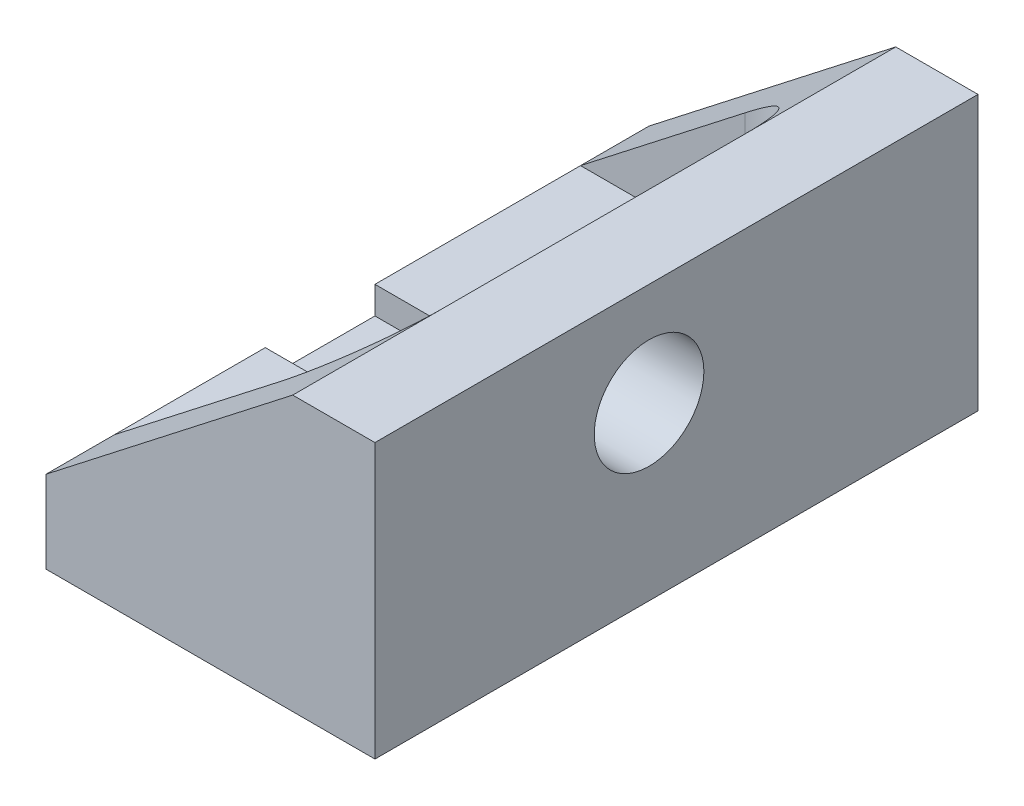
ISO-10303-21;
HEADER;
FILE_DESCRIPTION(('STEP AP214'),'2;1');
FILE_NAME('part.step','',(''),(''),'','','');
FILE_SCHEMA(('AUTOMOTIVE_DESIGN { 1 0 10303 214 1 1 1 1 }'));
ENDSEC;
DATA;
#1=APPLICATION_CONTEXT('core data for automotive mechanical design processes');
#2=APPLICATION_PROTOCOL_DEFINITION('international standard','automotive_design',2000,#1);
#3=PRODUCT_CONTEXT('',#1,'mechanical');
#4=PRODUCT('Part','Part','',(#3));
#5=PRODUCT_RELATED_PRODUCT_CATEGORY('part','',(#4));
#6=PRODUCT_DEFINITION_FORMATION('','',#4);
#7=PRODUCT_DEFINITION_CONTEXT('part definition',#1,'design');
#8=PRODUCT_DEFINITION('design','',#6,#7);
#9=PRODUCT_DEFINITION_SHAPE('','',#8);
#10=(LENGTH_UNIT() NAMED_UNIT(*) SI_UNIT(.MILLI.,.METRE.));
#11=(NAMED_UNIT(*) PLANE_ANGLE_UNIT() SI_UNIT($,.RADIAN.));
#12=(NAMED_UNIT(*) SI_UNIT($,.STERADIAN.) SOLID_ANGLE_UNIT());
#13=UNCERTAINTY_MEASURE_WITH_UNIT(LENGTH_MEASURE(1.E-05),#10,'distance_accuracy_value','');
#14=(GEOMETRIC_REPRESENTATION_CONTEXT(3) GLOBAL_UNCERTAINTY_ASSIGNED_CONTEXT((#13)) GLOBAL_UNIT_ASSIGNED_CONTEXT((#10,
#11,#12)) REPRESENTATION_CONTEXT('',''));
#15=CARTESIAN_POINT('',(0.,0.,0.));
#16=DIRECTION('',(0.,0.,1.));
#17=DIRECTION('',(1.,0.,0.));
#18=AXIS2_PLACEMENT_3D('',#15,#16,#17);
#19=CARTESIAN_POINT('',(0.,3.,0.));
#20=DIRECTION('',(0.,-1.,0.));
#21=DIRECTION('',(0.,0.,-1.));
#22=AXIS2_PLACEMENT_3D('',#19,#20,#21);
#23=PLANE('',#22);
#24=CARTESIAN_POINT('',(0.,3.,6.));
#25=DIRECTION('',(0.,1.,0.));
#26=DIRECTION('',(0.,0.,-1.));
#27=AXIS2_PLACEMENT_3D('',#24,#25,#26);
#28=CIRCLE('',#27,1.35);
#29=CARTESIAN_POINT('',(0.,3.,4.65));
#30=VERTEX_POINT('',#29);
#31=EDGE_CURVE('E266',#30,#30,#28,.T.);
#32=ORIENTED_EDGE('',*,*,#31,.F.);
#33=EDGE_LOOP('',(#32));
#34=FACE_BOUND('',#33,.T.);
#35=DIRECTION('',(0.,0.,1.));
#36=VECTOR('',#35,1.);
#37=CARTESIAN_POINT('',(5.,3.,-11.));
#38=LINE('',#37,#36);
#39=CARTESIAN_POINT('',(5.,3.,4.25));
#40=VERTEX_POINT('',#39);
#41=CARTESIAN_POINT('',(5.,3.,5.5));
#42=VERTEX_POINT('',#41);
#43=EDGE_CURVE('E265',#40,#42,#38,.T.);
#44=ORIENTED_EDGE('',*,*,#43,.F.);
#45=DIRECTION('',(1.,0.,0.));
#46=VECTOR('',#45,1.);
#47=CARTESIAN_POINT('',(1.5,3.,4.25));
#48=LINE('',#47,#46);
#49=CARTESIAN_POINT('',(1.5,3.,4.25));
#50=VERTEX_POINT('',#49);
#51=EDGE_CURVE('E186',#50,#40,#48,.T.);
#52=ORIENTED_EDGE('',*,*,#51,.F.);
#53=DIRECTION('',(0.,0.,1.));
#54=VECTOR('',#53,1.);
#55=CARTESIAN_POINT('',(1.5,3.,3.));
#56=LINE('',#55,#54);
#57=CARTESIAN_POINT('',(1.5,3.,3.));
#58=VERTEX_POINT('',#57);
#59=EDGE_CURVE('E189',#58,#50,#56,.T.);
#60=ORIENTED_EDGE('',*,*,#59,.F.);
#61=DIRECTION('',(1.,0.,0.));
#62=VECTOR('',#61,1.);
#63=CARTESIAN_POINT('',(-4.,3.,3.));
#64=LINE('',#63,#62);
#65=CARTESIAN_POINT('',(-4.,3.,3.));
#66=VERTEX_POINT('',#65);
#67=EDGE_CURVE('E209',#66,#58,#64,.T.);
#68=ORIENTED_EDGE('',*,*,#67,.F.);
#69=DIRECTION('',(0.,0.,1.));
#70=VECTOR('',#69,1.);
#71=CARTESIAN_POINT('',(-4.,3.,11.));
#72=LINE('',#71,#70);
#73=CARTESIAN_POINT('',(-4.,3.,8.5));
#74=VERTEX_POINT('',#73);
#75=EDGE_CURVE('E283',#66,#74,#72,.T.);
#76=ORIENTED_EDGE('',*,*,#75,.T.);
#77=DIRECTION('',(-1.,0.,0.));
#78=VECTOR('',#77,1.);
#79=CARTESIAN_POINT('',(5.,3.,8.5));
#80=LINE('',#79,#78);
#81=CARTESIAN_POINT('',(2.,3.,8.5));
#82=VERTEX_POINT('',#81);
#83=EDGE_CURVE('E232',#82,#74,#80,.T.);
#84=ORIENTED_EDGE('',*,*,#83,.F.);
#85=CARTESIAN_POINT('',(2.,3.,5.5));
#86=DIRECTION('',(0.,-1.,0.));
#87=DIRECTION('',(0.,0.,-1.));
#88=AXIS2_PLACEMENT_3D('',#85,#86,#87);
#89=CIRCLE('',#88,3.);
#90=EDGE_CURVE('E311',#82,#42,#89,.F.);
#91=ORIENTED_EDGE('',*,*,#90,.T.);
#92=EDGE_LOOP('',(#44,#52,#60,#68,#76,#84,#91));
#93=FACE_BOUND('',#92,.T.);
#94=ADVANCED_FACE('F34',(#34,#93),#23,.F.);
#95=CARTESIAN_POINT('',(0.,3.,-6.));
#96=DIRECTION('',(0.,1.,0.));
#97=DIRECTION('',(0.,0.,1.));
#98=AXIS2_PLACEMENT_3D('',#95,#96,#97);
#99=CIRCLE('',#98,1.35);
#100=CARTESIAN_POINT('',(0.,3.,-4.65));
#101=VERTEX_POINT('',#100);
#102=EDGE_CURVE('E272',#101,#101,#99,.T.);
#103=ORIENTED_EDGE('',*,*,#102,.F.);
#104=EDGE_LOOP('',(#103));
#105=FACE_BOUND('',#104,.T.);
#106=CARTESIAN_POINT('',(-4.,3.,-8.5));
#107=VERTEX_POINT('',#106);
#108=CARTESIAN_POINT('',(-4.,3.,-1.));
#109=VERTEX_POINT('',#108);
#110=EDGE_CURVE('E282',#107,#109,#72,.T.);
#111=ORIENTED_EDGE('',*,*,#110,.T.);
#112=DIRECTION('',(-1.,0.,0.));
#113=VECTOR('',#112,1.);
#114=CARTESIAN_POINT('',(-4.,3.,-1.));
#115=LINE('',#114,#113);
#116=CARTESIAN_POINT('',(1.5,3.,-1.));
#117=VERTEX_POINT('',#116);
#118=EDGE_CURVE('E207',#117,#109,#115,.T.);
#119=ORIENTED_EDGE('',*,*,#118,.F.);
#120=DIRECTION('',(0.,0.,1.));
#121=VECTOR('',#120,1.);
#122=CARTESIAN_POINT('',(1.5,3.,-2.25));
#123=LINE('',#122,#121);
#124=CARTESIAN_POINT('',(1.5,3.,-2.25));
#125=VERTEX_POINT('',#124);
#126=EDGE_CURVE('E204',#125,#117,#123,.T.);
#127=ORIENTED_EDGE('',*,*,#126,.F.);
#128=DIRECTION('',(-1.,0.,0.));
#129=VECTOR('',#128,1.);
#130=CARTESIAN_POINT('',(1.5,3.,-2.25));
#131=LINE('',#130,#129);
#132=CARTESIAN_POINT('',(5.,3.,-2.25));
#133=VERTEX_POINT('',#132);
#134=EDGE_CURVE('E202',#133,#125,#131,.T.);
#135=ORIENTED_EDGE('',*,*,#134,.F.);
#136=CARTESIAN_POINT('',(5.,3.,-5.5));
#137=VERTEX_POINT('',#136);
#138=EDGE_CURVE('E170',#137,#133,#38,.T.);
#139=ORIENTED_EDGE('',*,*,#138,.F.);
#140=CARTESIAN_POINT('',(2.,3.,-5.5));
#141=DIRECTION('',(0.,-1.,0.));
#142=DIRECTION('',(0.,0.,-1.));
#143=AXIS2_PLACEMENT_3D('',#140,#141,#142);
#144=CIRCLE('',#143,3.);
#145=CARTESIAN_POINT('',(2.,3.,-8.5));
#146=VERTEX_POINT('',#145);
#147=EDGE_CURVE('E309',#137,#146,#144,.F.);
#148=ORIENTED_EDGE('',*,*,#147,.T.);
#149=DIRECTION('',(-1.,0.,0.));
#150=VECTOR('',#149,1.);
#151=CARTESIAN_POINT('',(5.,3.,-8.5));
#152=LINE('',#151,#150);
#153=EDGE_CURVE('E245',#146,#107,#152,.T.);
#154=ORIENTED_EDGE('',*,*,#153,.T.);
#155=EDGE_LOOP('',(#111,#119,#127,#135,#139,#148,#154));
#156=FACE_BOUND('',#155,.T.);
#157=ADVANCED_FACE('F344',(#105,#156),#23,.F.);
#158=CARTESIAN_POINT('',(5.,10.,-11.));
#159=DIRECTION('',(1.,0.,0.));
#160=DIRECTION('',(0.,0.,-1.));
#161=AXIS2_PLACEMENT_3D('',#158,#159,#160);
#162=PLANE('',#161);
#163=CARTESIAN_POINT('',(5.,6.25,0.999999999999999));
#164=DIRECTION('',(1.,0.,0.));
#165=DIRECTION('',(0.,0.,-1.));
#166=AXIS2_PLACEMENT_3D('',#163,#164,#165);
#167=CIRCLE('',#166,2.);
#168=CARTESIAN_POINT('',(5.,6.25,-1.));
#169=VERTEX_POINT('',#168);
#170=EDGE_CURVE('E252',#169,#169,#167,.T.);
#171=ORIENTED_EDGE('',*,*,#170,.T.);
#172=EDGE_LOOP('',(#171));
#173=FACE_BOUND('',#172,.T.);
#174=ORIENTED_EDGE('',*,*,#138,.T.);
#175=DIRECTION('',(0.,1.,0.));
#176=VECTOR('',#175,1.);
#177=CARTESIAN_POINT('',(5.,2.,-2.25));
#178=LINE('',#177,#176);
#179=CARTESIAN_POINT('',(5.,2.,-2.25));
#180=VERTEX_POINT('',#179);
#181=EDGE_CURVE('E162',#180,#133,#178,.T.);
#182=ORIENTED_EDGE('',*,*,#181,.F.);
#183=DIRECTION('',(0.,0.,-1.));
#184=VECTOR('',#183,1.);
#185=CARTESIAN_POINT('',(5.,2.,-2.25));
#186=LINE('',#185,#184);
#187=CARTESIAN_POINT('',(5.,2.,4.25));
#188=VERTEX_POINT('',#187);
#189=EDGE_CURVE('E166',#188,#180,#186,.T.);
#190=ORIENTED_EDGE('',*,*,#189,.F.);
#191=DIRECTION('',(0.,1.,0.));
#192=VECTOR('',#191,1.);
#193=CARTESIAN_POINT('',(5.,2.,4.25));
#194=LINE('',#193,#192);
#195=EDGE_CURVE('E214',#188,#40,#194,.T.);
#196=ORIENTED_EDGE('',*,*,#195,.T.);
#197=ORIENTED_EDGE('',*,*,#43,.T.);
#198=DIRECTION('',(0.,-1.,0.));
#199=VECTOR('',#198,1.);
#200=CARTESIAN_POINT('',(5.,10.,5.5));
#201=LINE('',#200,#199);
#202=CARTESIAN_POINT('',(5.,10.,5.5));
#203=VERTEX_POINT('',#202);
#204=EDGE_CURVE('E316',#42,#203,#201,.F.);
#205=ORIENTED_EDGE('',*,*,#204,.T.);
#206=DIRECTION('',(0.,0.,1.));
#207=VECTOR('',#206,1.);
#208=CARTESIAN_POINT('',(5.,10.,-11.));
#209=LINE('',#208,#207);
#210=CARTESIAN_POINT('',(5.,10.,-5.5));
#211=VERTEX_POINT('',#210);
#212=EDGE_CURVE('E255',#211,#203,#209,.T.);
#213=ORIENTED_EDGE('',*,*,#212,.F.);
#214=DIRECTION('',(0.,-1.,0.));
#215=VECTOR('',#214,1.);
#216=CARTESIAN_POINT('',(5.,3.,-5.5));
#217=LINE('',#216,#215);
#218=EDGE_CURVE('E314',#211,#137,#217,.T.);
#219=ORIENTED_EDGE('',*,*,#218,.T.);
#220=EDGE_LOOP('',(#174,#182,#190,#196,#197,#205,#213,#219));
#221=FACE_BOUND('',#220,.T.);
#222=ADVANCED_FACE('F164',(#173,#221),#162,.F.);
#223=CARTESIAN_POINT('',(0.,0.,0.));
#224=DIRECTION('',(0.,-1.,0.));
#225=DIRECTION('',(0.,0.,-1.));
#226=AXIS2_PLACEMENT_3D('',#223,#224,#225);
#227=PLANE('',#226);
#228=CARTESIAN_POINT('',(0.,0.,-6.));
#229=DIRECTION('',(0.,1.,0.));
#230=DIRECTION('',(0.,0.,1.));
#231=AXIS2_PLACEMENT_3D('',#228,#229,#230);
#232=CIRCLE('',#231,1.35);
#233=CARTESIAN_POINT('',(0.,0.,-4.65));
#234=VERTEX_POINT('',#233);
#235=EDGE_CURVE('E269',#234,#234,#232,.T.);
#236=ORIENTED_EDGE('',*,*,#235,.T.);
#237=EDGE_LOOP('',(#236));
#238=FACE_BOUND('',#237,.T.);
#239=DIRECTION('',(-1.,0.,0.));
#240=VECTOR('',#239,1.);
#241=CARTESIAN_POINT('',(-4.,0.,-11.));
#242=LINE('',#241,#240);
#243=CARTESIAN_POINT('',(8.,0.,-11.));
#244=VERTEX_POINT('',#243);
#245=CARTESIAN_POINT('',(-4.,0.,-11.));
#246=VERTEX_POINT('',#245);
#247=EDGE_CURVE('E275',#244,#246,#242,.T.);
#248=ORIENTED_EDGE('',*,*,#247,.F.);
#249=DIRECTION('',(0.,0.,-1.));
#250=VECTOR('',#249,1.);
#251=CARTESIAN_POINT('',(8.,0.,-11.));
#252=LINE('',#251,#250);
#253=CARTESIAN_POINT('',(8.,0.,11.));
#254=VERTEX_POINT('',#253);
#255=EDGE_CURVE('E290',#254,#244,#252,.T.);
#256=ORIENTED_EDGE('',*,*,#255,.F.);
#257=DIRECTION('',(1.,0.,0.));
#258=VECTOR('',#257,1.);
#259=CARTESIAN_POINT('',(4.,0.,11.));
#260=LINE('',#259,#258);
#261=CARTESIAN_POINT('',(-4.,0.,11.));
#262=VERTEX_POINT('',#261);
#263=EDGE_CURVE('E288',#262,#254,#260,.T.);
#264=ORIENTED_EDGE('',*,*,#263,.F.);
#265=DIRECTION('',(0.,0.,1.));
#266=VECTOR('',#265,1.);
#267=CARTESIAN_POINT('',(-4.,0.,11.));
#268=LINE('',#267,#266);
#269=EDGE_CURVE('E285',#246,#262,#268,.T.);
#270=ORIENTED_EDGE('',*,*,#269,.F.);
#271=EDGE_LOOP('',(#248,#256,#264,#270));
#272=FACE_BOUND('',#271,.T.);
#273=CARTESIAN_POINT('',(0.,0.,6.));
#274=DIRECTION('',(0.,1.,0.));
#275=DIRECTION('',(0.,0.,-1.));
#276=AXIS2_PLACEMENT_3D('',#273,#274,#275);
#277=CIRCLE('',#276,1.35);
#278=CARTESIAN_POINT('',(0.,0.,4.65));
#279=VERTEX_POINT('',#278);
#280=EDGE_CURVE('E263',#279,#279,#277,.T.);
#281=ORIENTED_EDGE('',*,*,#280,.T.);
#282=EDGE_LOOP('',(#281));
#283=FACE_BOUND('',#282,.T.);
#284=ADVANCED_FACE('F370',(#238,#272,#283),#227,.T.);
#285=CARTESIAN_POINT('',(-4.,3.,-11.));
#286=DIRECTION('',(0.,0.,1.));
#287=DIRECTION('',(1.,0.,0.));
#288=AXIS2_PLACEMENT_3D('',#285,#286,#287);
#289=PLANE('',#288);
#290=DIRECTION('',(0.,-1.,0.));
#291=VECTOR('',#290,1.);
#292=CARTESIAN_POINT('',(-4.,3.,-11.));
#293=LINE('',#292,#291);
#294=CARTESIAN_POINT('',(-4.,3.,-11.));
#295=VERTEX_POINT('',#294);
#296=EDGE_CURVE('E301',#295,#246,#293,.T.);
#297=ORIENTED_EDGE('',*,*,#296,.F.);
#298=DIRECTION('',(0.789352217376326,0.61394061351492,0.));
#299=VECTOR('',#298,1.);
#300=CARTESIAN_POINT('',(-4.,3.,-11.));
#301=LINE('',#300,#299);
#302=CARTESIAN_POINT('',(5.,10.,-11.));
#303=VERTEX_POINT('',#302);
#304=EDGE_CURVE('E240',#295,#303,#301,.T.);
#305=ORIENTED_EDGE('',*,*,#304,.T.);
#306=DIRECTION('',(-1.,0.,0.));
#307=VECTOR('',#306,1.);
#308=CARTESIAN_POINT('',(5.,10.,-11.));
#309=LINE('',#308,#307);
#310=CARTESIAN_POINT('',(8.,10.,-11.));
#311=VERTEX_POINT('',#310);
#312=EDGE_CURVE('E253',#311,#303,#309,.T.);
#313=ORIENTED_EDGE('',*,*,#312,.F.);
#314=DIRECTION('',(0.,-1.,0.));
#315=VECTOR('',#314,1.);
#316=CARTESIAN_POINT('',(8.,3.,-11.));
#317=LINE('',#316,#315);
#318=EDGE_CURVE('E281',#311,#244,#317,.T.);
#319=ORIENTED_EDGE('',*,*,#318,.T.);
#320=ORIENTED_EDGE('',*,*,#247,.T.);
#321=EDGE_LOOP('',(#297,#305,#313,#319,#320));
#322=FACE_BOUND('',#321,.T.);
#323=ADVANCED_FACE('F366',(#322),#289,.F.);
#324=CARTESIAN_POINT('',(-4.,3.,11.));
#325=DIRECTION('',(1.,0.,0.));
#326=DIRECTION('',(0.,0.,-1.));
#327=AXIS2_PLACEMENT_3D('',#324,#325,#326);
#328=PLANE('',#327);
#329=ORIENTED_EDGE('',*,*,#75,.F.);
#330=DIRECTION('',(0.,1.,0.));
#331=VECTOR('',#330,1.);
#332=CARTESIAN_POINT('',(-4.,2.,3.));
#333=LINE('',#332,#331);
#334=CARTESIAN_POINT('',(-4.,2.,3.));
#335=VERTEX_POINT('',#334);
#336=EDGE_CURVE('E221',#335,#66,#333,.T.);
#337=ORIENTED_EDGE('',*,*,#336,.F.);
#338=DIRECTION('',(0.,0.,1.));
#339=VECTOR('',#338,1.);
#340=CARTESIAN_POINT('',(-4.,2.,-1.));
#341=LINE('',#340,#339);
#342=CARTESIAN_POINT('',(-4.,2.,-1.));
#343=VERTEX_POINT('',#342);
#344=EDGE_CURVE('E194',#343,#335,#341,.T.);
#345=ORIENTED_EDGE('',*,*,#344,.F.);
#346=DIRECTION('',(0.,1.,0.));
#347=VECTOR('',#346,1.);
#348=CARTESIAN_POINT('',(-4.,2.,-1.));
#349=LINE('',#348,#347);
#350=EDGE_CURVE('E223',#343,#109,#349,.T.);
#351=ORIENTED_EDGE('',*,*,#350,.T.);
#352=ORIENTED_EDGE('',*,*,#110,.F.);
#353=EDGE_CURVE('E278',#295,#107,#72,.T.);
#354=ORIENTED_EDGE('',*,*,#353,.F.);
#355=ORIENTED_EDGE('',*,*,#296,.T.);
#356=ORIENTED_EDGE('',*,*,#269,.T.);
#357=DIRECTION('',(0.,-1.,0.));
#358=VECTOR('',#357,1.);
#359=CARTESIAN_POINT('',(-4.,3.,11.));
#360=LINE('',#359,#358);
#361=CARTESIAN_POINT('',(-4.,3.,11.));
#362=VERTEX_POINT('',#361);
#363=EDGE_CURVE('E298',#362,#262,#360,.T.);
#364=ORIENTED_EDGE('',*,*,#363,.F.);
#365=DIRECTION('',(0.,0.,1.));
#366=VECTOR('',#365,1.);
#367=CARTESIAN_POINT('',(-4.,3.,8.5));
#368=LINE('',#367,#366);
#369=EDGE_CURVE('E235',#74,#362,#368,.T.);
#370=ORIENTED_EDGE('',*,*,#369,.F.);
#371=EDGE_LOOP('',(#329,#337,#345,#351,#352,#354,#355,#356,#364,#370));
#372=FACE_BOUND('',#371,.T.);
#373=ADVANCED_FACE('F348',(#372),#328,.F.);
#374=CARTESIAN_POINT('',(4.,3.,11.));
#375=DIRECTION('',(0.,0.,-1.));
#376=DIRECTION('',(-1.,0.,0.));
#377=AXIS2_PLACEMENT_3D('',#374,#375,#376);
#378=PLANE('',#377);
#379=ORIENTED_EDGE('',*,*,#263,.T.);
#380=DIRECTION('',(0.,-1.,0.));
#381=VECTOR('',#380,1.);
#382=CARTESIAN_POINT('',(8.,3.,11.));
#383=LINE('',#382,#381);
#384=CARTESIAN_POINT('',(8.,10.,11.));
#385=VERTEX_POINT('',#384);
#386=EDGE_CURVE('E295',#385,#254,#383,.T.);
#387=ORIENTED_EDGE('',*,*,#386,.F.);
#388=DIRECTION('',(1.,0.,0.));
#389=VECTOR('',#388,1.);
#390=CARTESIAN_POINT('',(5.,10.,11.));
#391=LINE('',#390,#389);
#392=CARTESIAN_POINT('',(5.,10.,11.));
#393=VERTEX_POINT('',#392);
#394=EDGE_CURVE('E257',#393,#385,#391,.T.);
#395=ORIENTED_EDGE('',*,*,#394,.F.);
#396=DIRECTION('',(0.789352217376326,0.61394061351492,0.));
#397=VECTOR('',#396,1.);
#398=CARTESIAN_POINT('',(-4.,3.,11.));
#399=LINE('',#398,#397);
#400=EDGE_CURVE('E216',#362,#393,#399,.T.);
#401=ORIENTED_EDGE('',*,*,#400,.F.);
#402=ORIENTED_EDGE('',*,*,#363,.T.);
#403=EDGE_LOOP('',(#379,#387,#395,#401,#402));
#404=FACE_BOUND('',#403,.T.);
#405=ADVANCED_FACE('F374',(#404),#378,.F.);
#406=CARTESIAN_POINT('',(8.,3.,-11.));
#407=DIRECTION('',(-1.,0.,0.));
#408=DIRECTION('',(0.,0.,1.));
#409=AXIS2_PLACEMENT_3D('',#406,#407,#408);
#410=PLANE('',#409);
#411=CARTESIAN_POINT('',(8.,6.25,0.999999999999999));
#412=DIRECTION('',(1.,0.,0.));
#413=DIRECTION('',(0.,0.,-1.));
#414=AXIS2_PLACEMENT_3D('',#411,#412,#413);
#415=CIRCLE('',#414,2.);
#416=CARTESIAN_POINT('',(8.,6.25,-1.));
#417=VERTEX_POINT('',#416);
#418=EDGE_CURVE('E247',#417,#417,#415,.T.);
#419=ORIENTED_EDGE('',*,*,#418,.F.);
#420=EDGE_LOOP('',(#419));
#421=FACE_BOUND('',#420,.T.);
#422=ORIENTED_EDGE('',*,*,#255,.T.);
#423=ORIENTED_EDGE('',*,*,#318,.F.);
#424=DIRECTION('',(0.,0.,-1.));
#425=VECTOR('',#424,1.);
#426=CARTESIAN_POINT('',(8.,10.,11.));
#427=LINE('',#426,#425);
#428=EDGE_CURVE('E260',#385,#311,#427,.T.);
#429=ORIENTED_EDGE('',*,*,#428,.F.);
#430=ORIENTED_EDGE('',*,*,#386,.T.);
#431=EDGE_LOOP('',(#422,#423,#429,#430));
#432=FACE_BOUND('',#431,.T.);
#433=ADVANCED_FACE('F379',(#421,#432),#410,.F.);
#434=CARTESIAN_POINT('',(0.,3.,-6.));
#435=DIRECTION('',(0.,-1.,0.));
#436=DIRECTION('',(0.,0.,-1.));
#437=AXIS2_PLACEMENT_3D('',#434,#435,#436);
#438=CYLINDRICAL_SURFACE('',#437,1.35);
#439=ORIENTED_EDGE('',*,*,#102,.T.);
#440=EDGE_LOOP('',(#439));
#441=FACE_BOUND('',#440,.T.);
#442=ORIENTED_EDGE('',*,*,#235,.F.);
#443=EDGE_LOOP('',(#442));
#444=FACE_BOUND('',#443,.T.);
#445=ADVANCED_FACE('F406',(#441,#444),#438,.F.);
#446=CARTESIAN_POINT('',(0.,3.,6.));
#447=DIRECTION('',(0.,-1.,0.));
#448=DIRECTION('',(0.,0.,-1.));
#449=AXIS2_PLACEMENT_3D('',#446,#447,#448);
#450=CYLINDRICAL_SURFACE('',#449,1.35);
#451=ORIENTED_EDGE('',*,*,#31,.T.);
#452=EDGE_LOOP('',(#451));
#453=FACE_BOUND('',#452,.T.);
#454=ORIENTED_EDGE('',*,*,#280,.F.);
#455=EDGE_LOOP('',(#454));
#456=FACE_BOUND('',#455,.T.);
#457=ADVANCED_FACE('F442',(#453,#456),#450,.F.);
#458=CARTESIAN_POINT('',(0.,10.,0.));
#459=DIRECTION('',(0.,1.,0.));
#460=DIRECTION('',(0.,0.,1.));
#461=AXIS2_PLACEMENT_3D('',#458,#459,#460);
#462=PLANE('',#461);
#463=ORIENTED_EDGE('',*,*,#312,.T.);
#464=EDGE_CURVE('E57',#303,#211,#209,.T.);
#465=ORIENTED_EDGE('',*,*,#464,.T.);
#466=ORIENTED_EDGE('',*,*,#212,.T.);
#467=DIRECTION('',(0.,0.,1.));
#468=VECTOR('',#467,1.);
#469=CARTESIAN_POINT('',(5.,10.,8.5));
#470=LINE('',#469,#468);
#471=EDGE_CURVE('E237',#203,#393,#470,.T.);
#472=ORIENTED_EDGE('',*,*,#471,.T.);
#473=ORIENTED_EDGE('',*,*,#394,.T.);
#474=ORIENTED_EDGE('',*,*,#428,.T.);
#475=EDGE_LOOP('',(#463,#465,#466,#472,#473,#474));
#476=FACE_BOUND('',#475,.T.);
#477=ADVANCED_FACE('F380',(#476),#462,.T.);
#478=CARTESIAN_POINT('',(-4.,6.25,0.999999999999999));
#479=DIRECTION('',(1.,0.,0.));
#480=DIRECTION('',(0.,0.,-1.));
#481=AXIS2_PLACEMENT_3D('',#478,#479,#480);
#482=CYLINDRICAL_SURFACE('',#481,2.);
#483=ORIENTED_EDGE('',*,*,#418,.T.);
#484=EDGE_LOOP('',(#483));
#485=FACE_BOUND('',#484,.T.);
#486=ORIENTED_EDGE('',*,*,#170,.F.);
#487=EDGE_LOOP('',(#486));
#488=FACE_BOUND('',#487,.T.);
#489=ADVANCED_FACE('F436',(#485,#488),#482,.F.);
#490=CARTESIAN_POINT('',(-4.,3.,-8.5));
#491=DIRECTION('',(-0.61394061351492,0.789352217376326,0.));
#492=DIRECTION('',(-0.789352217376326,-0.61394061351492,0.));
#493=AXIS2_PLACEMENT_3D('',#490,#491,#492);
#494=PLANE('',#493);
#495=ORIENTED_EDGE('',*,*,#304,.F.);
#496=ORIENTED_EDGE('',*,*,#353,.T.);
#497=DIRECTION('',(0.789352217376326,0.61394061351492,0.));
#498=VECTOR('',#497,1.);
#499=CARTESIAN_POINT('',(-4.,3.,-8.5));
#500=LINE('',#499,#498);
#501=CARTESIAN_POINT('',(2.,7.66666666666667,-8.5));
#502=VERTEX_POINT('',#501);
#503=EDGE_CURVE('E242',#107,#502,#500,.T.);
#504=ORIENTED_EDGE('',*,*,#503,.T.);
#505=CARTESIAN_POINT('',(2.,7.66666666666667,-5.5));
#506=DIRECTION('',(-0.61394061351492,0.789352217376326,0.));
#507=DIRECTION('',(0.789352217376326,0.61394061351492,0.));
#508=AXIS2_PLACEMENT_3D('',#505,#506,#507);
#509=ELLIPSE('',#508,3.80058475033046,3.);
#510=EDGE_CURVE('E11',#502,#211,#509,.F.);
#511=ORIENTED_EDGE('',*,*,#510,.T.);
#512=ORIENTED_EDGE('',*,*,#464,.F.);
#513=EDGE_LOOP('',(#495,#496,#504,#511,#512));
#514=FACE_BOUND('',#513,.T.);
#515=ADVANCED_FACE('F362',(#514),#494,.T.);
#516=CARTESIAN_POINT('',(0.,0.,-8.5));
#517=DIRECTION('',(0.,0.,-1.));
#518=DIRECTION('',(-1.,0.,0.));
#519=AXIS2_PLACEMENT_3D('',#516,#517,#518);
#520=PLANE('',#519);
#521=ORIENTED_EDGE('',*,*,#153,.F.);
#522=DIRECTION('',(0.,-1.,0.));
#523=VECTOR('',#522,1.);
#524=CARTESIAN_POINT('',(2.,10.,-8.5));
#525=LINE('',#524,#523);
#526=EDGE_CURVE('E319',#146,#502,#525,.F.);
#527=ORIENTED_EDGE('',*,*,#526,.T.);
#528=ORIENTED_EDGE('',*,*,#503,.F.);
#529=EDGE_LOOP('',(#521,#527,#528));
#530=FACE_BOUND('',#529,.T.);
#531=ADVANCED_FACE('F359',(#530),#520,.F.);
#532=CARTESIAN_POINT('',(-4.,3.,8.5));
#533=DIRECTION('',(0.61394061351492,-0.789352217376326,0.));
#534=DIRECTION('',(0.789352217376326,0.61394061351492,0.));
#535=AXIS2_PLACEMENT_3D('',#532,#533,#534);
#536=PLANE('',#535);
#537=ORIENTED_EDGE('',*,*,#400,.T.);
#538=ORIENTED_EDGE('',*,*,#471,.F.);
#539=CARTESIAN_POINT('',(2.,7.66666666666667,5.5));
#540=DIRECTION('',(0.61394061351492,-0.789352217376326,0.));
#541=DIRECTION('',(0.789352217376326,0.61394061351492,0.));
#542=AXIS2_PLACEMENT_3D('',#539,#540,#541);
#543=ELLIPSE('',#542,3.80058475033046,3.);
#544=CARTESIAN_POINT('',(2.,7.66666666666667,8.5));
#545=VERTEX_POINT('',#544);
#546=EDGE_CURVE('E42',#203,#545,#543,.T.);
#547=ORIENTED_EDGE('',*,*,#546,.T.);
#548=DIRECTION('',(0.789352217376326,0.61394061351492,0.));
#549=VECTOR('',#548,1.);
#550=CARTESIAN_POINT('',(-4.,3.,8.5));
#551=LINE('',#550,#549);
#552=EDGE_CURVE('E229',#74,#545,#551,.T.);
#553=ORIENTED_EDGE('',*,*,#552,.F.);
#554=ORIENTED_EDGE('',*,*,#369,.T.);
#555=EDGE_LOOP('',(#537,#538,#547,#553,#554));
#556=FACE_BOUND('',#555,.T.);
#557=ADVANCED_FACE('F323',(#556),#536,.F.);
#558=CARTESIAN_POINT('',(0.,0.,8.5));
#559=DIRECTION('',(0.,0.,1.));
#560=DIRECTION('',(-1.,0.,0.));
#561=AXIS2_PLACEMENT_3D('',#558,#559,#560);
#562=PLANE('',#561);
#563=ORIENTED_EDGE('',*,*,#552,.T.);
#564=DIRECTION('',(0.,-1.,0.));
#565=VECTOR('',#564,1.);
#566=CARTESIAN_POINT('',(2.,3.,8.5));
#567=LINE('',#566,#565);
#568=EDGE_CURVE('E304',#545,#82,#567,.T.);
#569=ORIENTED_EDGE('',*,*,#568,.T.);
#570=ORIENTED_EDGE('',*,*,#83,.T.);
#571=EDGE_LOOP('',(#563,#569,#570));
#572=FACE_BOUND('',#571,.T.);
#573=ADVANCED_FACE('F329',(#572),#562,.F.);
#574=CARTESIAN_POINT('',(2.,0.,5.5));
#575=DIRECTION('',(0.,1.,0.));
#576=DIRECTION('',(0.,0.,1.));
#577=AXIS2_PLACEMENT_3D('',#574,#575,#576);
#578=CYLINDRICAL_SURFACE('',#577,3.);
#579=ORIENTED_EDGE('',*,*,#546,.F.);
#580=ORIENTED_EDGE('',*,*,#204,.F.);
#581=ORIENTED_EDGE('',*,*,#90,.F.);
#582=ORIENTED_EDGE('',*,*,#568,.F.);
#583=EDGE_LOOP('',(#579,#580,#581,#582));
#584=FACE_BOUND('',#583,.T.);
#585=ADVANCED_FACE('F331',(#584),#578,.F.);
#586=CARTESIAN_POINT('',(2.,10.,-5.5));
#587=DIRECTION('',(0.,1.,0.));
#588=DIRECTION('',(0.,0.,1.));
#589=AXIS2_PLACEMENT_3D('',#586,#587,#588);
#590=CYLINDRICAL_SURFACE('',#589,3.);
#591=ORIENTED_EDGE('',*,*,#510,.F.);
#592=ORIENTED_EDGE('',*,*,#526,.F.);
#593=ORIENTED_EDGE('',*,*,#147,.F.);
#594=ORIENTED_EDGE('',*,*,#218,.F.);
#595=EDGE_LOOP('',(#591,#592,#593,#594));
#596=FACE_BOUND('',#595,.T.);
#597=ADVANCED_FACE('F36',(#596),#590,.F.);
#598=CARTESIAN_POINT('',(1.5,2.,4.25));
#599=DIRECTION('',(0.,0.,1.));
#600=DIRECTION('',(1.,0.,0.));
#601=AXIS2_PLACEMENT_3D('',#598,#599,#600);
#602=PLANE('',#601);
#603=ORIENTED_EDGE('',*,*,#51,.T.);
#604=ORIENTED_EDGE('',*,*,#195,.F.);
#605=DIRECTION('',(1.,0.,0.));
#606=VECTOR('',#605,1.);
#607=CARTESIAN_POINT('',(1.5,2.,4.25));
#608=LINE('',#607,#606);
#609=CARTESIAN_POINT('',(1.5,2.,4.25));
#610=VERTEX_POINT('',#609);
#611=EDGE_CURVE('E175',#610,#188,#608,.T.);
#612=ORIENTED_EDGE('',*,*,#611,.F.);
#613=DIRECTION('',(0.,1.,0.));
#614=VECTOR('',#613,1.);
#615=CARTESIAN_POINT('',(1.5,2.,4.25));
#616=LINE('',#615,#614);
#617=EDGE_CURVE('E217',#610,#50,#616,.T.);
#618=ORIENTED_EDGE('',*,*,#617,.T.);
#619=EDGE_LOOP('',(#603,#604,#612,#618));
#620=FACE_BOUND('',#619,.T.);
#621=ADVANCED_FACE('F382',(#620),#602,.F.);
#622=CARTESIAN_POINT('',(1.5,2.,3.));
#623=DIRECTION('',(-1.,0.,0.));
#624=DIRECTION('',(0.,0.,1.));
#625=AXIS2_PLACEMENT_3D('',#622,#623,#624);
#626=PLANE('',#625);
#627=ORIENTED_EDGE('',*,*,#59,.T.);
#628=ORIENTED_EDGE('',*,*,#617,.F.);
#629=DIRECTION('',(0.,0.,1.));
#630=VECTOR('',#629,1.);
#631=CARTESIAN_POINT('',(1.5,2.,3.));
#632=LINE('',#631,#630);
#633=CARTESIAN_POINT('',(1.5,2.,3.));
#634=VERTEX_POINT('',#633);
#635=EDGE_CURVE('E199',#634,#610,#632,.T.);
#636=ORIENTED_EDGE('',*,*,#635,.F.);
#637=DIRECTION('',(0.,1.,0.));
#638=VECTOR('',#637,1.);
#639=CARTESIAN_POINT('',(1.5,2.,3.));
#640=LINE('',#639,#638);
#641=EDGE_CURVE('E219',#634,#58,#640,.T.);
#642=ORIENTED_EDGE('',*,*,#641,.T.);
#643=EDGE_LOOP('',(#627,#628,#636,#642));
#644=FACE_BOUND('',#643,.T.);
#645=ADVANCED_FACE('F384',(#644),#626,.F.);
#646=CARTESIAN_POINT('',(-4.,2.,3.));
#647=DIRECTION('',(0.,0.,1.));
#648=DIRECTION('',(1.,0.,0.));
#649=AXIS2_PLACEMENT_3D('',#646,#647,#648);
#650=PLANE('',#649);
#651=ORIENTED_EDGE('',*,*,#67,.T.);
#652=ORIENTED_EDGE('',*,*,#641,.F.);
#653=DIRECTION('',(1.,0.,0.));
#654=VECTOR('',#653,1.);
#655=CARTESIAN_POINT('',(-4.,2.,3.));
#656=LINE('',#655,#654);
#657=EDGE_CURVE('E196',#335,#634,#656,.T.);
#658=ORIENTED_EDGE('',*,*,#657,.F.);
#659=ORIENTED_EDGE('',*,*,#336,.T.);
#660=EDGE_LOOP('',(#651,#652,#658,#659));
#661=FACE_BOUND('',#660,.T.);
#662=ADVANCED_FACE('F387',(#661),#650,.F.);
#663=CARTESIAN_POINT('',(-4.,2.,-1.));
#664=DIRECTION('',(0.,0.,-1.));
#665=DIRECTION('',(-1.,0.,0.));
#666=AXIS2_PLACEMENT_3D('',#663,#664,#665);
#667=PLANE('',#666);
#668=ORIENTED_EDGE('',*,*,#118,.T.);
#669=ORIENTED_EDGE('',*,*,#350,.F.);
#670=DIRECTION('',(-1.,0.,0.));
#671=VECTOR('',#670,1.);
#672=CARTESIAN_POINT('',(-4.,2.,-1.));
#673=LINE('',#672,#671);
#674=CARTESIAN_POINT('',(1.5,2.,-1.));
#675=VERTEX_POINT('',#674);
#676=EDGE_CURVE('E49',#675,#343,#673,.T.);
#677=ORIENTED_EDGE('',*,*,#676,.F.);
#678=DIRECTION('',(0.,1.,0.));
#679=VECTOR('',#678,1.);
#680=CARTESIAN_POINT('',(1.5,2.,-1.));
#681=LINE('',#680,#679);
#682=EDGE_CURVE('E226',#675,#117,#681,.T.);
#683=ORIENTED_EDGE('',*,*,#682,.T.);
#684=EDGE_LOOP('',(#668,#669,#677,#683));
#685=FACE_BOUND('',#684,.T.);
#686=ADVANCED_FACE('F351',(#685),#667,.F.);
#687=CARTESIAN_POINT('',(1.5,2.,-2.25));
#688=DIRECTION('',(-1.,0.,0.));
#689=DIRECTION('',(0.,0.,1.));
#690=AXIS2_PLACEMENT_3D('',#687,#688,#689);
#691=PLANE('',#690);
#692=ORIENTED_EDGE('',*,*,#126,.T.);
#693=ORIENTED_EDGE('',*,*,#682,.F.);
#694=DIRECTION('',(0.,0.,1.));
#695=VECTOR('',#694,1.);
#696=CARTESIAN_POINT('',(1.5,2.,-2.25));
#697=LINE('',#696,#695);
#698=CARTESIAN_POINT('',(1.5,2.,-2.25));
#699=VERTEX_POINT('',#698);
#700=EDGE_CURVE('E181',#699,#675,#697,.T.);
#701=ORIENTED_EDGE('',*,*,#700,.F.);
#702=DIRECTION('',(0.,1.,0.));
#703=VECTOR('',#702,1.);
#704=CARTESIAN_POINT('',(1.5,2.,-2.25));
#705=LINE('',#704,#703);
#706=EDGE_CURVE('E174',#699,#125,#705,.T.);
#707=ORIENTED_EDGE('',*,*,#706,.T.);
#708=EDGE_LOOP('',(#692,#693,#701,#707));
#709=FACE_BOUND('',#708,.T.);
#710=ADVANCED_FACE('F353',(#709),#691,.F.);
#711=CARTESIAN_POINT('',(1.5,2.,-2.25));
#712=DIRECTION('',(0.,0.,-1.));
#713=DIRECTION('',(-1.,0.,0.));
#714=AXIS2_PLACEMENT_3D('',#711,#712,#713);
#715=PLANE('',#714);
#716=ORIENTED_EDGE('',*,*,#134,.T.);
#717=ORIENTED_EDGE('',*,*,#706,.F.);
#718=DIRECTION('',(-1.,0.,0.));
#719=VECTOR('',#718,1.);
#720=CARTESIAN_POINT('',(1.5,2.,-2.25));
#721=LINE('',#720,#719);
#722=EDGE_CURVE('E178',#180,#699,#721,.T.);
#723=ORIENTED_EDGE('',*,*,#722,.F.);
#724=ORIENTED_EDGE('',*,*,#181,.T.);
#725=EDGE_LOOP('',(#716,#717,#723,#724));
#726=FACE_BOUND('',#725,.T.);
#727=ADVANCED_FACE('F179',(#726),#715,.F.);
#728=CARTESIAN_POINT('',(0.,2.,0.));
#729=DIRECTION('',(0.,1.,0.));
#730=DIRECTION('',(0.,0.,1.));
#731=AXIS2_PLACEMENT_3D('',#728,#729,#730);
#732=PLANE('',#731);
#733=ORIENTED_EDGE('',*,*,#189,.T.);
#734=ORIENTED_EDGE('',*,*,#722,.T.);
#735=ORIENTED_EDGE('',*,*,#700,.T.);
#736=ORIENTED_EDGE('',*,*,#676,.T.);
#737=ORIENTED_EDGE('',*,*,#344,.T.);
#738=ORIENTED_EDGE('',*,*,#657,.T.);
#739=ORIENTED_EDGE('',*,*,#635,.T.);
#740=ORIENTED_EDGE('',*,*,#611,.T.);
#741=EDGE_LOOP('',(#733,#734,#735,#736,#737,#738,#739,#740));
#742=FACE_BOUND('',#741,.T.);
#743=ADVANCED_FACE('F183',(#742),#732,.T.);
#744=CLOSED_SHELL('',(#94,#157,#222,#284,#323,#373,#405,#433,#445,#457,#477,#489,#515,#531,#557,
#573,#585,#597,#621,#645,#662,#686,#710,#727,#743));
#745=MANIFOLD_SOLID_BREP('B2',#744);
#746=ADVANCED_BREP_SHAPE_REPRESENTATION('',(#18,#745),#14);
#747=SHAPE_DEFINITION_REPRESENTATION(#9,#746);
ENDSEC;
END-ISO-10303-21;
